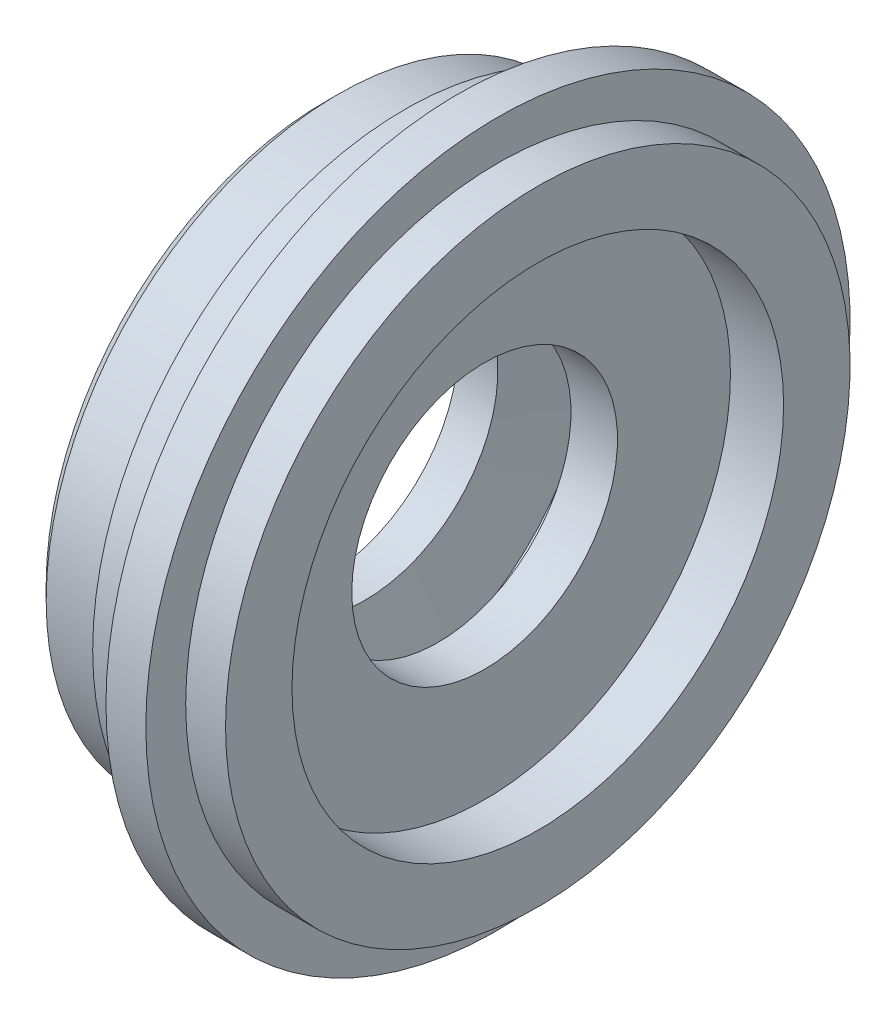
ISO-10303-21;
HEADER;
FILE_DESCRIPTION(('STEP AP214'),'2;1');
FILE_NAME('part.step','',(''),(''),'','','');
FILE_SCHEMA(('AUTOMOTIVE_DESIGN { 1 0 10303 214 1 1 1 1 }'));
ENDSEC;
DATA;
#1=APPLICATION_CONTEXT('core data for automotive mechanical design processes');
#2=APPLICATION_PROTOCOL_DEFINITION('international standard','automotive_design',2000,#1);
#3=PRODUCT_CONTEXT('',#1,'mechanical');
#4=PRODUCT('Part','Part','',(#3));
#5=PRODUCT_RELATED_PRODUCT_CATEGORY('part','',(#4));
#6=PRODUCT_DEFINITION_FORMATION('','',#4);
#7=PRODUCT_DEFINITION_CONTEXT('part definition',#1,'design');
#8=PRODUCT_DEFINITION('design','',#6,#7);
#9=PRODUCT_DEFINITION_SHAPE('','',#8);
#10=(LENGTH_UNIT() NAMED_UNIT(*) SI_UNIT(.MILLI.,.METRE.));
#11=(NAMED_UNIT(*) PLANE_ANGLE_UNIT() SI_UNIT($,.RADIAN.));
#12=(NAMED_UNIT(*) SI_UNIT($,.STERADIAN.) SOLID_ANGLE_UNIT());
#13=UNCERTAINTY_MEASURE_WITH_UNIT(LENGTH_MEASURE(1.E-05),#10,'distance_accuracy_value','');
#14=(GEOMETRIC_REPRESENTATION_CONTEXT(3) GLOBAL_UNCERTAINTY_ASSIGNED_CONTEXT((#13)) GLOBAL_UNIT_ASSIGNED_CONTEXT((#10,
#11,#12)) REPRESENTATION_CONTEXT('',''));
#15=CARTESIAN_POINT('',(0.,0.,0.));
#16=DIRECTION('',(0.,0.,1.));
#17=DIRECTION('',(1.,0.,0.));
#18=AXIS2_PLACEMENT_3D('',#15,#16,#17);
#19=CARTESIAN_POINT('',(0.,0.,0.));
#20=DIRECTION('',(1.,0.,0.));
#21=DIRECTION('',(0.,0.,-1.));
#22=AXIS2_PLACEMENT_3D('',#19,#20,#21);
#23=CONICAL_SURFACE('',#22,21.,0.785398163397449);
#24=CARTESIAN_POINT('',(1.,0.,0.));
#25=DIRECTION('',(-1.,0.,0.));
#26=DIRECTION('',(0.,0.,1.));
#27=AXIS2_PLACEMENT_3D('',#24,#25,#26);
#28=CIRCLE('',#27,22.);
#29=CARTESIAN_POINT('',(1.,0.,22.));
#30=VERTEX_POINT('',#29);
#31=EDGE_CURVE('E92',#30,#30,#28,.T.);
#32=ORIENTED_EDGE('',*,*,#31,.T.);
#33=EDGE_LOOP('',(#32));
#34=FACE_BOUND('',#33,.T.);
#35=CARTESIAN_POINT('',(0.,0.,0.));
#36=DIRECTION('',(-1.,0.,0.));
#37=DIRECTION('',(0.,0.,1.));
#38=AXIS2_PLACEMENT_3D('',#35,#36,#37);
#39=CIRCLE('',#38,21.);
#40=CARTESIAN_POINT('',(0.,0.,21.));
#41=VERTEX_POINT('',#40);
#42=EDGE_CURVE('E10',#41,#41,#39,.T.);
#43=ORIENTED_EDGE('',*,*,#42,.F.);
#44=EDGE_LOOP('',(#43));
#45=FACE_BOUND('',#44,.T.);
#46=ADVANCED_FACE('F37',(#34,#45),#23,.T.);
#47=CARTESIAN_POINT('',(0.,0.,0.));
#48=DIRECTION('',(-1.,0.,0.));
#49=DIRECTION('',(0.,0.,1.));
#50=AXIS2_PLACEMENT_3D('',#47,#48,#49);
#51=PLANE('',#50);
#52=ORIENTED_EDGE('',*,*,#42,.T.);
#53=EDGE_LOOP('',(#52));
#54=FACE_BOUND('',#53,.T.);
#55=CARTESIAN_POINT('',(0.,0.,0.));
#56=DIRECTION('',(-1.,0.,0.));
#57=DIRECTION('',(0.,0.,1.));
#58=AXIS2_PLACEMENT_3D('',#55,#56,#57);
#59=CIRCLE('',#58,10.);
#60=CARTESIAN_POINT('',(0.,0.,10.));
#61=VERTEX_POINT('',#60);
#62=EDGE_CURVE('E43',#61,#61,#59,.T.);
#63=ORIENTED_EDGE('',*,*,#62,.F.);
#64=EDGE_LOOP('',(#63));
#65=FACE_BOUND('',#64,.T.);
#66=ADVANCED_FACE('F110',(#54,#65),#51,.T.);
#67=CARTESIAN_POINT('',(0.,0.,0.));
#68=DIRECTION('',(-1.,0.,0.));
#69=DIRECTION('',(0.,0.,1.));
#70=AXIS2_PLACEMENT_3D('',#67,#68,#69);
#71=CYLINDRICAL_SURFACE('',#70,10.);
#72=ORIENTED_EDGE('',*,*,#62,.T.);
#73=EDGE_LOOP('',(#72));
#74=FACE_BOUND('',#73,.T.);
#75=CARTESIAN_POINT('',(3.,0.,0.));
#76=DIRECTION('',(-1.,0.,0.));
#77=DIRECTION('',(0.,0.,1.));
#78=AXIS2_PLACEMENT_3D('',#75,#76,#77);
#79=CIRCLE('',#78,10.);
#80=CARTESIAN_POINT('',(3.,0.,10.));
#81=VERTEX_POINT('',#80);
#82=EDGE_CURVE('E47',#81,#81,#79,.T.);
#83=ORIENTED_EDGE('',*,*,#82,.F.);
#84=EDGE_LOOP('',(#83));
#85=FACE_BOUND('',#84,.T.);
#86=ADVANCED_FACE('F114',(#74,#85),#71,.F.);
#87=CARTESIAN_POINT('',(3.75,0.,0.));
#88=DIRECTION('',(1.,0.,0.));
#89=DIRECTION('',(0.,0.,-1.));
#90=AXIS2_PLACEMENT_3D('',#87,#88,#89);
#91=CONICAL_SURFACE('',#90,16.5,1.455919721378);
#92=ORIENTED_EDGE('',*,*,#82,.T.);
#93=EDGE_LOOP('',(#92));
#94=FACE_BOUND('',#93,.T.);
#95=CARTESIAN_POINT('',(3.75,0.,0.));
#96=DIRECTION('',(-1.,0.,0.));
#97=DIRECTION('',(0.,0.,1.));
#98=AXIS2_PLACEMENT_3D('',#95,#96,#97);
#99=CIRCLE('',#98,16.5);
#100=CARTESIAN_POINT('',(3.75,0.,16.5));
#101=VERTEX_POINT('',#100);
#102=EDGE_CURVE('E51',#101,#101,#99,.T.);
#103=ORIENTED_EDGE('',*,*,#102,.F.);
#104=EDGE_LOOP('',(#103));
#105=FACE_BOUND('',#104,.T.);
#106=ADVANCED_FACE('F118',(#94,#105),#91,.F.);
#107=CARTESIAN_POINT('',(0.,0.,0.));
#108=DIRECTION('',(-1.,0.,0.));
#109=DIRECTION('',(0.,0.,1.));
#110=AXIS2_PLACEMENT_3D('',#107,#108,#109);
#111=CYLINDRICAL_SURFACE('',#110,16.5);
#112=ORIENTED_EDGE('',*,*,#102,.T.);
#113=EDGE_LOOP('',(#112));
#114=FACE_BOUND('',#113,.T.);
#115=CARTESIAN_POINT('',(7.75,0.,0.));
#116=DIRECTION('',(-1.,0.,0.));
#117=DIRECTION('',(0.,0.,1.));
#118=AXIS2_PLACEMENT_3D('',#115,#116,#117);
#119=CIRCLE('',#118,16.5);
#120=CARTESIAN_POINT('',(7.75,0.,16.5));
#121=VERTEX_POINT('',#120);
#122=EDGE_CURVE('E56',#121,#121,#119,.T.);
#123=ORIENTED_EDGE('',*,*,#122,.F.);
#124=EDGE_LOOP('',(#123));
#125=FACE_BOUND('',#124,.T.);
#126=ADVANCED_FACE('F124',(#114,#125),#111,.F.);
#127=CARTESIAN_POINT('',(7.75,0.,0.));
#128=DIRECTION('',(-1.,0.,0.));
#129=DIRECTION('',(0.,0.,1.));
#130=AXIS2_PLACEMENT_3D('',#127,#128,#129);
#131=CONICAL_SURFACE('',#130,16.5,1.455919721378);
#132=CARTESIAN_POINT('',(8.5,0.,0.));
#133=DIRECTION('',(-1.,0.,0.));
#134=DIRECTION('',(0.,0.,1.));
#135=AXIS2_PLACEMENT_3D('',#132,#133,#134);
#136=CIRCLE('',#135,10.);
#137=CARTESIAN_POINT('',(8.5,0.,10.));
#138=VERTEX_POINT('',#137);
#139=EDGE_CURVE('E59',#138,#138,#136,.T.);
#140=ORIENTED_EDGE('',*,*,#139,.F.);
#141=EDGE_LOOP('',(#140));
#142=FACE_BOUND('',#141,.T.);
#143=ORIENTED_EDGE('',*,*,#122,.T.);
#144=EDGE_LOOP('',(#143));
#145=FACE_BOUND('',#144,.T.);
#146=ADVANCED_FACE('F128',(#142,#145),#131,.F.);
#147=CARTESIAN_POINT('',(0.,0.,0.));
#148=DIRECTION('',(-1.,0.,0.));
#149=DIRECTION('',(0.,0.,1.));
#150=AXIS2_PLACEMENT_3D('',#147,#148,#149);
#151=CYLINDRICAL_SURFACE('',#150,10.);
#152=ORIENTED_EDGE('',*,*,#139,.T.);
#153=EDGE_LOOP('',(#152));
#154=FACE_BOUND('',#153,.T.);
#155=CARTESIAN_POINT('',(12.,0.,0.));
#156=DIRECTION('',(-1.,0.,0.));
#157=DIRECTION('',(0.,0.,1.));
#158=AXIS2_PLACEMENT_3D('',#155,#156,#157);
#159=CIRCLE('',#158,10.);
#160=CARTESIAN_POINT('',(12.,0.,10.));
#161=VERTEX_POINT('',#160);
#162=EDGE_CURVE('E62',#161,#161,#159,.T.);
#163=ORIENTED_EDGE('',*,*,#162,.F.);
#164=EDGE_LOOP('',(#163));
#165=FACE_BOUND('',#164,.T.);
#166=ADVANCED_FACE('F132',(#154,#165),#151,.F.);
#167=CARTESIAN_POINT('',(12.,0.,0.));
#168=DIRECTION('',(1.,0.,0.));
#169=DIRECTION('',(0.,0.,-1.));
#170=AXIS2_PLACEMENT_3D('',#167,#168,#169);
#171=PLANE('',#170);
#172=ORIENTED_EDGE('',*,*,#162,.T.);
#173=EDGE_LOOP('',(#172));
#174=FACE_BOUND('',#173,.T.);
#175=CARTESIAN_POINT('',(12.,0.,0.));
#176=DIRECTION('',(-1.,0.,0.));
#177=DIRECTION('',(0.,0.,1.));
#178=AXIS2_PLACEMENT_3D('',#175,#176,#177);
#179=CIRCLE('',#178,18.5);
#180=CARTESIAN_POINT('',(12.,0.,18.5));
#181=VERTEX_POINT('',#180);
#182=EDGE_CURVE('E65',#181,#181,#179,.T.);
#183=ORIENTED_EDGE('',*,*,#182,.F.);
#184=EDGE_LOOP('',(#183));
#185=FACE_BOUND('',#184,.T.);
#186=ADVANCED_FACE('F136',(#174,#185),#171,.T.);
#187=CARTESIAN_POINT('',(0.,0.,0.));
#188=DIRECTION('',(-1.,0.,0.));
#189=DIRECTION('',(0.,0.,1.));
#190=AXIS2_PLACEMENT_3D('',#187,#188,#189);
#191=CYLINDRICAL_SURFACE('',#190,18.5);
#192=ORIENTED_EDGE('',*,*,#182,.T.);
#193=EDGE_LOOP('',(#192));
#194=FACE_BOUND('',#193,.T.);
#195=CARTESIAN_POINT('',(16.,0.,0.));
#196=DIRECTION('',(-1.,0.,0.));
#197=DIRECTION('',(0.,0.,1.));
#198=AXIS2_PLACEMENT_3D('',#195,#196,#197);
#199=CIRCLE('',#198,18.5);
#200=CARTESIAN_POINT('',(16.,0.,18.5));
#201=VERTEX_POINT('',#200);
#202=EDGE_CURVE('E68',#201,#201,#199,.T.);
#203=ORIENTED_EDGE('',*,*,#202,.F.);
#204=EDGE_LOOP('',(#203));
#205=FACE_BOUND('',#204,.T.);
#206=ADVANCED_FACE('F140',(#194,#205),#191,.F.);
#207=CARTESIAN_POINT('',(16.,0.,0.));
#208=DIRECTION('',(1.,0.,0.));
#209=DIRECTION('',(0.,0.,-1.));
#210=AXIS2_PLACEMENT_3D('',#207,#208,#209);
#211=PLANE('',#210);
#212=ORIENTED_EDGE('',*,*,#202,.T.);
#213=EDGE_LOOP('',(#212));
#214=FACE_BOUND('',#213,.T.);
#215=CARTESIAN_POINT('',(16.,0.,0.));
#216=DIRECTION('',(-1.,0.,0.));
#217=DIRECTION('',(0.,0.,1.));
#218=AXIS2_PLACEMENT_3D('',#215,#216,#217);
#219=CIRCLE('',#218,23.5);
#220=CARTESIAN_POINT('',(16.,0.,23.5));
#221=VERTEX_POINT('',#220);
#222=EDGE_CURVE('E71',#221,#221,#219,.T.);
#223=ORIENTED_EDGE('',*,*,#222,.F.);
#224=EDGE_LOOP('',(#223));
#225=FACE_BOUND('',#224,.T.);
#226=ADVANCED_FACE('F144',(#214,#225),#211,.T.);
#227=CARTESIAN_POINT('',(0.,0.,0.));
#228=DIRECTION('',(-1.,0.,0.));
#229=DIRECTION('',(0.,0.,1.));
#230=AXIS2_PLACEMENT_3D('',#227,#228,#229);
#231=CYLINDRICAL_SURFACE('',#230,23.5);
#232=ORIENTED_EDGE('',*,*,#222,.T.);
#233=EDGE_LOOP('',(#232));
#234=FACE_BOUND('',#233,.T.);
#235=CARTESIAN_POINT('',(13.,0.,0.));
#236=DIRECTION('',(-1.,0.,0.));
#237=DIRECTION('',(0.,0.,1.));
#238=AXIS2_PLACEMENT_3D('',#235,#236,#237);
#239=CIRCLE('',#238,23.5);
#240=CARTESIAN_POINT('',(13.,0.,23.5));
#241=VERTEX_POINT('',#240);
#242=EDGE_CURVE('E74',#241,#241,#239,.T.);
#243=ORIENTED_EDGE('',*,*,#242,.F.);
#244=EDGE_LOOP('',(#243));
#245=FACE_BOUND('',#244,.T.);
#246=ADVANCED_FACE('F148',(#234,#245),#231,.T.);
#247=CARTESIAN_POINT('',(13.,0.,0.));
#248=DIRECTION('',(1.,0.,0.));
#249=DIRECTION('',(0.,0.,-1.));
#250=AXIS2_PLACEMENT_3D('',#247,#248,#249);
#251=PLANE('',#250);
#252=ORIENTED_EDGE('',*,*,#242,.T.);
#253=EDGE_LOOP('',(#252));
#254=FACE_BOUND('',#253,.T.);
#255=CARTESIAN_POINT('',(13.,0.,0.));
#256=DIRECTION('',(-1.,0.,0.));
#257=DIRECTION('',(0.,0.,1.));
#258=AXIS2_PLACEMENT_3D('',#255,#256,#257);
#259=CIRCLE('',#258,26.5);
#260=CARTESIAN_POINT('',(13.,0.,26.5));
#261=VERTEX_POINT('',#260);
#262=EDGE_CURVE('E77',#261,#261,#259,.T.);
#263=ORIENTED_EDGE('',*,*,#262,.F.);
#264=EDGE_LOOP('',(#263));
#265=FACE_BOUND('',#264,.T.);
#266=ADVANCED_FACE('F152',(#254,#265),#251,.T.);
#267=CARTESIAN_POINT('',(0.,0.,0.));
#268=DIRECTION('',(-1.,0.,0.));
#269=DIRECTION('',(0.,0.,1.));
#270=AXIS2_PLACEMENT_3D('',#267,#268,#269);
#271=CYLINDRICAL_SURFACE('',#270,26.5);
#272=ORIENTED_EDGE('',*,*,#262,.T.);
#273=EDGE_LOOP('',(#272));
#274=FACE_BOUND('',#273,.T.);
#275=CARTESIAN_POINT('',(10.,0.,0.));
#276=DIRECTION('',(-1.,0.,0.));
#277=DIRECTION('',(0.,0.,1.));
#278=AXIS2_PLACEMENT_3D('',#275,#276,#277);
#279=CIRCLE('',#278,26.5);
#280=CARTESIAN_POINT('',(10.,0.,26.5));
#281=VERTEX_POINT('',#280);
#282=EDGE_CURVE('E80',#281,#281,#279,.T.);
#283=ORIENTED_EDGE('',*,*,#282,.F.);
#284=EDGE_LOOP('',(#283));
#285=FACE_BOUND('',#284,.T.);
#286=ADVANCED_FACE('F156',(#274,#285),#271,.T.);
#287=CARTESIAN_POINT('',(10.,0.,0.));
#288=DIRECTION('',(-1.,0.,0.));
#289=DIRECTION('',(0.,0.,1.));
#290=AXIS2_PLACEMENT_3D('',#287,#288,#289);
#291=PLANE('',#290);
#292=ORIENTED_EDGE('',*,*,#282,.T.);
#293=EDGE_LOOP('',(#292));
#294=FACE_BOUND('',#293,.T.);
#295=CARTESIAN_POINT('',(10.,0.,0.));
#296=DIRECTION('',(-1.,0.,0.));
#297=DIRECTION('',(0.,0.,1.));
#298=AXIS2_PLACEMENT_3D('',#295,#296,#297);
#299=CIRCLE('',#298,23.5);
#300=CARTESIAN_POINT('',(10.,0.,23.5));
#301=VERTEX_POINT('',#300);
#302=EDGE_CURVE('E83',#301,#301,#299,.T.);
#303=ORIENTED_EDGE('',*,*,#302,.F.);
#304=EDGE_LOOP('',(#303));
#305=FACE_BOUND('',#304,.T.);
#306=ADVANCED_FACE('F160',(#294,#305),#291,.T.);
#307=CARTESIAN_POINT('',(0.,0.,0.));
#308=DIRECTION('',(-1.,0.,0.));
#309=DIRECTION('',(0.,0.,1.));
#310=AXIS2_PLACEMENT_3D('',#307,#308,#309);
#311=CYLINDRICAL_SURFACE('',#310,23.5);
#312=ORIENTED_EDGE('',*,*,#302,.T.);
#313=EDGE_LOOP('',(#312));
#314=FACE_BOUND('',#313,.T.);
#315=CARTESIAN_POINT('',(6.,0.,0.));
#316=DIRECTION('',(-1.,0.,0.));
#317=DIRECTION('',(0.,0.,1.));
#318=AXIS2_PLACEMENT_3D('',#315,#316,#317);
#319=CIRCLE('',#318,23.5);
#320=CARTESIAN_POINT('',(6.,0.,23.5));
#321=VERTEX_POINT('',#320);
#322=EDGE_CURVE('E86',#321,#321,#319,.T.);
#323=ORIENTED_EDGE('',*,*,#322,.F.);
#324=EDGE_LOOP('',(#323));
#325=FACE_BOUND('',#324,.T.);
#326=ADVANCED_FACE('F106',(#314,#325),#311,.T.);
#327=CARTESIAN_POINT('',(6.,0.,0.));
#328=DIRECTION('',(-1.,0.,0.));
#329=DIRECTION('',(0.,0.,1.));
#330=AXIS2_PLACEMENT_3D('',#327,#328,#329);
#331=PLANE('',#330);
#332=ORIENTED_EDGE('',*,*,#322,.T.);
#333=EDGE_LOOP('',(#332));
#334=FACE_BOUND('',#333,.T.);
#335=CARTESIAN_POINT('',(6.,0.,0.));
#336=DIRECTION('',(-1.,0.,0.));
#337=DIRECTION('',(0.,0.,1.));
#338=AXIS2_PLACEMENT_3D('',#335,#336,#337);
#339=CIRCLE('',#338,22.);
#340=CARTESIAN_POINT('',(6.,0.,22.));
#341=VERTEX_POINT('',#340);
#342=EDGE_CURVE('E89',#341,#341,#339,.T.);
#343=ORIENTED_EDGE('',*,*,#342,.F.);
#344=EDGE_LOOP('',(#343));
#345=FACE_BOUND('',#344,.T.);
#346=ADVANCED_FACE('F100',(#334,#345),#331,.T.);
#347=CARTESIAN_POINT('',(0.,0.,0.));
#348=DIRECTION('',(-1.,0.,0.));
#349=DIRECTION('',(0.,0.,1.));
#350=AXIS2_PLACEMENT_3D('',#347,#348,#349);
#351=CYLINDRICAL_SURFACE('',#350,22.);
#352=ORIENTED_EDGE('',*,*,#342,.T.);
#353=EDGE_LOOP('',(#352));
#354=FACE_BOUND('',#353,.T.);
#355=ORIENTED_EDGE('',*,*,#31,.F.);
#356=EDGE_LOOP('',(#355));
#357=FACE_BOUND('',#356,.T.);
#358=ADVANCED_FACE('F98',(#354,#357),#351,.T.);
#359=CLOSED_SHELL('',(#46,#66,#86,#106,#126,#146,#166,#186,#206,#226,#246,#266,#286,#306,#326,
#346,#358));
#360=MANIFOLD_SOLID_BREP('B2',#359);
#361=ADVANCED_BREP_SHAPE_REPRESENTATION('',(#18,#360),#14);
#362=SHAPE_DEFINITION_REPRESENTATION(#9,#361);
ENDSEC;
END-ISO-10303-21;
